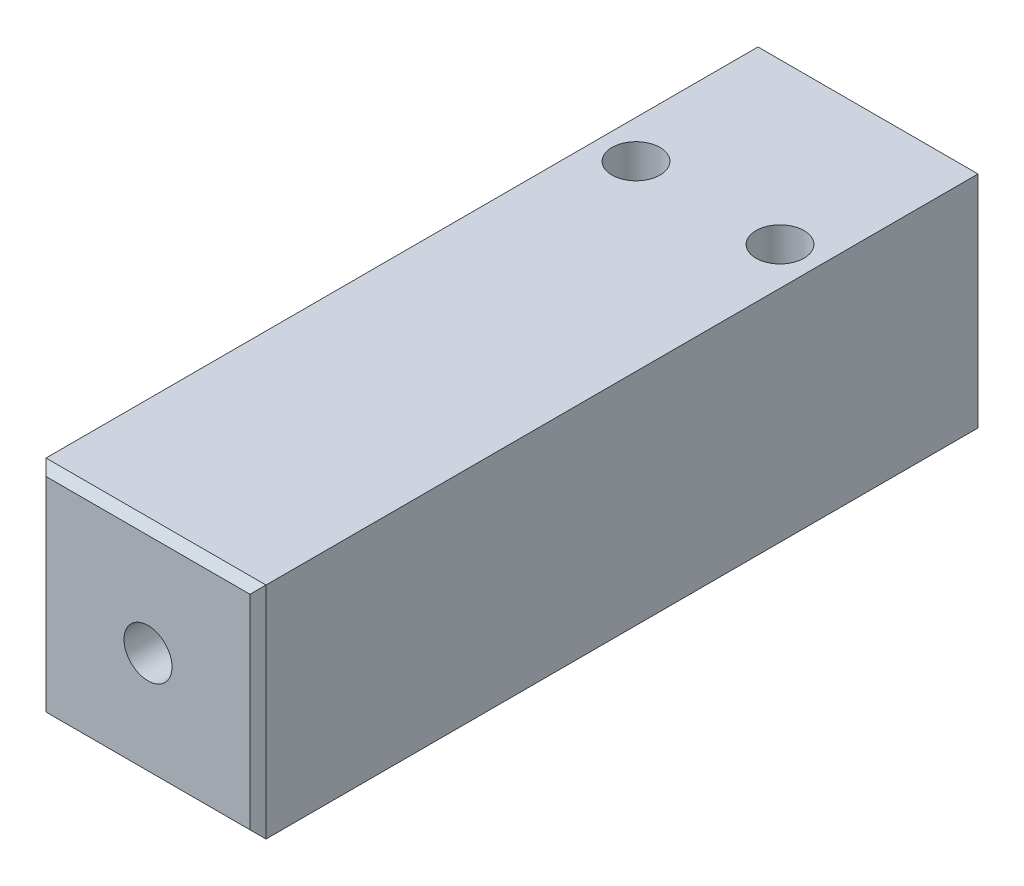
ISO-10303-21;
HEADER;
FILE_DESCRIPTION(('STEP AP214'),'2;1');
FILE_NAME('part.step','',(''),(''),'','','');
FILE_SCHEMA(('AUTOMOTIVE_DESIGN { 1 0 10303 214 1 1 1 1 }'));
ENDSEC;
DATA;
#1=APPLICATION_CONTEXT('core data for automotive mechanical design processes');
#2=APPLICATION_PROTOCOL_DEFINITION('international standard','automotive_design',2000,#1);
#3=PRODUCT_CONTEXT('',#1,'mechanical');
#4=PRODUCT('Part','Part','',(#3));
#5=PRODUCT_RELATED_PRODUCT_CATEGORY('part','',(#4));
#6=PRODUCT_DEFINITION_FORMATION('','',#4);
#7=PRODUCT_DEFINITION_CONTEXT('part definition',#1,'design');
#8=PRODUCT_DEFINITION('design','',#6,#7);
#9=PRODUCT_DEFINITION_SHAPE('','',#8);
#10=(LENGTH_UNIT() NAMED_UNIT(*) SI_UNIT(.MILLI.,.METRE.));
#11=(NAMED_UNIT(*) PLANE_ANGLE_UNIT() SI_UNIT($,.RADIAN.));
#12=(NAMED_UNIT(*) SI_UNIT($,.STERADIAN.) SOLID_ANGLE_UNIT());
#13=UNCERTAINTY_MEASURE_WITH_UNIT(LENGTH_MEASURE(1.E-05),#10,'distance_accuracy_value','');
#14=(GEOMETRIC_REPRESENTATION_CONTEXT(3) GLOBAL_UNCERTAINTY_ASSIGNED_CONTEXT((#13)) GLOBAL_UNIT_ASSIGNED_CONTEXT((#10,
#11,#12)) REPRESENTATION_CONTEXT('',''));
#15=CARTESIAN_POINT('',(0.,0.,0.));
#16=DIRECTION('',(0.,0.,1.));
#17=DIRECTION('',(1.,0.,0.));
#18=AXIS2_PLACEMENT_3D('',#15,#16,#17);
#19=CARTESIAN_POINT('',(27.5,27.5,-180.));
#20=DIRECTION('',(1.,0.,0.));
#21=DIRECTION('',(0.,1.,0.));
#22=AXIS2_PLACEMENT_3D('',#19,#20,#21);
#23=PLANE('',#22);
#24=DIRECTION('',(0.,0.,1.));
#25=VECTOR('',#24,1.);
#26=CARTESIAN_POINT('',(27.5,27.5,-180.));
#27=LINE('',#26,#25);
#28=CARTESIAN_POINT('',(27.5,27.5,-180.));
#29=VERTEX_POINT('',#28);
#30=CARTESIAN_POINT('',(27.5,27.5,-2.00000000000006));
#31=VERTEX_POINT('',#30);
#32=EDGE_CURVE('E84',#29,#31,#27,.T.);
#33=ORIENTED_EDGE('',*,*,#32,.T.);
#34=DIRECTION('',(0.,-1.,0.));
#35=VECTOR('',#34,1.);
#36=CARTESIAN_POINT('',(27.5,27.5,-2.));
#37=LINE('',#36,#35);
#38=CARTESIAN_POINT('',(27.5,-27.5,-2.00000000000006));
#39=VERTEX_POINT('',#38);
#40=EDGE_CURVE('E41',#31,#39,#37,.T.);
#41=ORIENTED_EDGE('',*,*,#40,.T.);
#42=DIRECTION('',(0.,0.,1.));
#43=VECTOR('',#42,1.);
#44=CARTESIAN_POINT('',(27.5,-27.5,-180.));
#45=LINE('',#44,#43);
#46=CARTESIAN_POINT('',(27.5,-27.5,-180.));
#47=VERTEX_POINT('',#46);
#48=EDGE_CURVE('E105',#47,#39,#45,.T.);
#49=ORIENTED_EDGE('',*,*,#48,.F.);
#50=DIRECTION('',(0.,1.,0.));
#51=VECTOR('',#50,1.);
#52=CARTESIAN_POINT('',(27.5,27.5,-180.));
#53=LINE('',#52,#51);
#54=EDGE_CURVE('E99',#47,#29,#53,.T.);
#55=ORIENTED_EDGE('',*,*,#54,.T.);
#56=EDGE_LOOP('',(#33,#41,#49,#55));
#57=FACE_BOUND('',#56,.T.);
#58=ADVANCED_FACE('F32',(#57),#23,.T.);
#59=CARTESIAN_POINT('',(-27.5,-27.5,-180.));
#60=DIRECTION('',(0.,-1.,0.));
#61=DIRECTION('',(0.,0.,-1.));
#62=AXIS2_PLACEMENT_3D('',#59,#60,#61);
#63=PLANE('',#62);
#64=ORIENTED_EDGE('',*,*,#48,.T.);
#65=DIRECTION('',(-1.,0.,0.));
#66=VECTOR('',#65,1.);
#67=CARTESIAN_POINT('',(-27.5,-27.5,-2.));
#68=LINE('',#67,#66);
#69=CARTESIAN_POINT('',(-27.5,-27.5,-2.00000000000006));
#70=VERTEX_POINT('',#69);
#71=EDGE_CURVE('E128',#39,#70,#68,.T.);
#72=ORIENTED_EDGE('',*,*,#71,.T.);
#73=DIRECTION('',(0.,0.,1.));
#74=VECTOR('',#73,1.);
#75=CARTESIAN_POINT('',(-27.5,-27.5,-180.));
#76=LINE('',#75,#74);
#77=CARTESIAN_POINT('',(-27.5,-27.5,-180.));
#78=VERTEX_POINT('',#77);
#79=EDGE_CURVE('E117',#78,#70,#76,.T.);
#80=ORIENTED_EDGE('',*,*,#79,.F.);
#81=DIRECTION('',(1.,0.,0.));
#82=VECTOR('',#81,1.);
#83=CARTESIAN_POINT('',(-27.5,-27.5,-180.));
#84=LINE('',#83,#82);
#85=EDGE_CURVE('E92',#78,#47,#84,.T.);
#86=ORIENTED_EDGE('',*,*,#85,.T.);
#87=EDGE_LOOP('',(#64,#72,#80,#86));
#88=FACE_BOUND('',#87,.T.);
#89=ADVANCED_FACE('F205',(#88),#63,.T.);
#90=CARTESIAN_POINT('',(-27.5,27.5,-180.));
#91=DIRECTION('',(-1.,0.,0.));
#92=DIRECTION('',(0.,-1.,0.));
#93=AXIS2_PLACEMENT_3D('',#90,#91,#92);
#94=PLANE('',#93);
#95=ORIENTED_EDGE('',*,*,#79,.T.);
#96=DIRECTION('',(0.,1.,0.));
#97=VECTOR('',#96,1.);
#98=CARTESIAN_POINT('',(-27.5,27.5,-2.));
#99=LINE('',#98,#97);
#100=CARTESIAN_POINT('',(-27.5,27.5,-2.00000000000006));
#101=VERTEX_POINT('',#100);
#102=EDGE_CURVE('E55',#70,#101,#99,.T.);
#103=ORIENTED_EDGE('',*,*,#102,.T.);
#104=DIRECTION('',(0.,0.,1.));
#105=VECTOR('',#104,1.);
#106=CARTESIAN_POINT('',(-27.5,27.5,-180.));
#107=LINE('',#106,#105);
#108=CARTESIAN_POINT('',(-27.5,27.5,-180.));
#109=VERTEX_POINT('',#108);
#110=EDGE_CURVE('E91',#109,#101,#107,.T.);
#111=ORIENTED_EDGE('',*,*,#110,.F.);
#112=DIRECTION('',(0.,-1.,0.));
#113=VECTOR('',#112,1.);
#114=CARTESIAN_POINT('',(-27.5,27.5,-180.));
#115=LINE('',#114,#113);
#116=EDGE_CURVE('E102',#109,#78,#115,.T.);
#117=ORIENTED_EDGE('',*,*,#116,.T.);
#118=EDGE_LOOP('',(#95,#103,#111,#117));
#119=FACE_BOUND('',#118,.T.);
#120=ADVANCED_FACE('F198',(#119),#94,.T.);
#121=CARTESIAN_POINT('',(-27.5,27.5,-180.));
#122=DIRECTION('',(0.,1.,0.));
#123=DIRECTION('',(0.,0.,1.));
#124=AXIS2_PLACEMENT_3D('',#121,#122,#123);
#125=PLANE('',#124);
#126=CARTESIAN_POINT('',(18.,27.5,-140.));
#127=DIRECTION('',(0.,1.,0.));
#128=DIRECTION('',(0.,0.,1.));
#129=AXIS2_PLACEMENT_3D('',#126,#127,#128);
#130=CIRCLE('',#129,6.);
#131=CARTESIAN_POINT('',(18.,27.5,-134.));
#132=VERTEX_POINT('',#131);
#133=EDGE_CURVE('E142',#132,#132,#130,.T.);
#134=ORIENTED_EDGE('',*,*,#133,.F.);
#135=EDGE_LOOP('',(#134));
#136=FACE_BOUND('',#135,.T.);
#137=CARTESIAN_POINT('',(-18.,27.5,-140.));
#138=DIRECTION('',(0.,1.,0.));
#139=DIRECTION('',(0.,0.,1.));
#140=AXIS2_PLACEMENT_3D('',#137,#138,#139);
#141=CIRCLE('',#140,6.);
#142=CARTESIAN_POINT('',(-18.,27.5,-134.));
#143=VERTEX_POINT('',#142);
#144=EDGE_CURVE('E152',#143,#143,#141,.T.);
#145=ORIENTED_EDGE('',*,*,#144,.F.);
#146=EDGE_LOOP('',(#145));
#147=FACE_BOUND('',#146,.T.);
#148=ORIENTED_EDGE('',*,*,#110,.T.);
#149=DIRECTION('',(1.,0.,0.));
#150=VECTOR('',#149,1.);
#151=CARTESIAN_POINT('',(-27.5,27.5,-2.));
#152=LINE('',#151,#150);
#153=EDGE_CURVE('E11',#101,#31,#152,.T.);
#154=ORIENTED_EDGE('',*,*,#153,.T.);
#155=ORIENTED_EDGE('',*,*,#32,.F.);
#156=DIRECTION('',(-1.,0.,0.));
#157=VECTOR('',#156,1.);
#158=CARTESIAN_POINT('',(-27.5,27.5,-180.));
#159=LINE('',#158,#157);
#160=EDGE_CURVE('E87',#29,#109,#159,.T.);
#161=ORIENTED_EDGE('',*,*,#160,.T.);
#162=EDGE_LOOP('',(#148,#154,#155,#161));
#163=FACE_BOUND('',#162,.T.);
#164=ADVANCED_FACE('F86',(#136,#147,#163),#125,.T.);
#165=CARTESIAN_POINT('',(0.,0.,-180.));
#166=DIRECTION('',(0.,0.,1.));
#167=DIRECTION('',(1.,0.,0.));
#168=AXIS2_PLACEMENT_3D('',#165,#166,#167);
#169=PLANE('',#168);
#170=CARTESIAN_POINT('',(-18.,-18.,-180.));
#171=DIRECTION('',(0.,0.,-1.));
#172=DIRECTION('',(-1.,0.,0.));
#173=AXIS2_PLACEMENT_3D('',#170,#171,#172);
#174=CIRCLE('',#173,4.);
#175=CARTESIAN_POINT('',(-22.,-18.,-180.));
#176=VERTEX_POINT('',#175);
#177=EDGE_CURVE('E158',#176,#176,#174,.T.);
#178=ORIENTED_EDGE('',*,*,#177,.F.);
#179=EDGE_LOOP('',(#178));
#180=FACE_BOUND('',#179,.T.);
#181=CARTESIAN_POINT('',(18.,-18.,-180.));
#182=DIRECTION('',(0.,0.,-1.));
#183=DIRECTION('',(-1.,0.,0.));
#184=AXIS2_PLACEMENT_3D('',#181,#182,#183);
#185=CIRCLE('',#184,4.);
#186=CARTESIAN_POINT('',(14.,-18.,-180.));
#187=VERTEX_POINT('',#186);
#188=EDGE_CURVE('E164',#187,#187,#185,.T.);
#189=ORIENTED_EDGE('',*,*,#188,.F.);
#190=EDGE_LOOP('',(#189));
#191=FACE_BOUND('',#190,.T.);
#192=CARTESIAN_POINT('',(18.,18.,-180.));
#193=DIRECTION('',(0.,0.,-1.));
#194=DIRECTION('',(-1.,0.,0.));
#195=AXIS2_PLACEMENT_3D('',#192,#193,#194);
#196=CIRCLE('',#195,4.);
#197=CARTESIAN_POINT('',(14.,18.,-180.));
#198=VERTEX_POINT('',#197);
#199=EDGE_CURVE('E170',#198,#198,#196,.T.);
#200=ORIENTED_EDGE('',*,*,#199,.F.);
#201=EDGE_LOOP('',(#200));
#202=FACE_BOUND('',#201,.T.);
#203=CARTESIAN_POINT('',(-18.,18.,-180.));
#204=DIRECTION('',(0.,0.,-1.));
#205=DIRECTION('',(-1.,0.,0.));
#206=AXIS2_PLACEMENT_3D('',#203,#204,#205);
#207=CIRCLE('',#206,4.);
#208=CARTESIAN_POINT('',(-22.,18.,-180.));
#209=VERTEX_POINT('',#208);
#210=EDGE_CURVE('E176',#209,#209,#207,.T.);
#211=ORIENTED_EDGE('',*,*,#210,.F.);
#212=EDGE_LOOP('',(#211));
#213=FACE_BOUND('',#212,.T.);
#214=ORIENTED_EDGE('',*,*,#54,.F.);
#215=ORIENTED_EDGE('',*,*,#85,.F.);
#216=ORIENTED_EDGE('',*,*,#116,.F.);
#217=ORIENTED_EDGE('',*,*,#160,.F.);
#218=EDGE_LOOP('',(#214,#215,#216,#217));
#219=FACE_BOUND('',#218,.T.);
#220=ADVANCED_FACE('F97',(#180,#191,#202,#213,#219),#169,.F.);
#221=CARTESIAN_POINT('',(0.,0.,0.));
#222=DIRECTION('',(0.,0.,1.));
#223=DIRECTION('',(1.,0.,0.));
#224=AXIS2_PLACEMENT_3D('',#221,#222,#223);
#225=PLANE('',#224);
#226=DIRECTION('',(0.,-1.,0.));
#227=VECTOR('',#226,1.);
#228=CARTESIAN_POINT('',(-25.5,0.,0.));
#229=LINE('',#228,#227);
#230=CARTESIAN_POINT('',(-25.5,25.5,0.));
#231=VERTEX_POINT('',#230);
#232=CARTESIAN_POINT('',(-25.5,-25.5,0.));
#233=VERTEX_POINT('',#232);
#234=EDGE_CURVE('E123',#231,#233,#229,.T.);
#235=ORIENTED_EDGE('',*,*,#234,.T.);
#236=DIRECTION('',(1.,0.,0.));
#237=VECTOR('',#236,1.);
#238=CARTESIAN_POINT('',(0.,-25.5,0.));
#239=LINE('',#238,#237);
#240=CARTESIAN_POINT('',(25.5,-25.5,0.));
#241=VERTEX_POINT('',#240);
#242=EDGE_CURVE('E125',#233,#241,#239,.T.);
#243=ORIENTED_EDGE('',*,*,#242,.T.);
#244=DIRECTION('',(0.,1.,0.));
#245=VECTOR('',#244,1.);
#246=CARTESIAN_POINT('',(25.5,0.,0.));
#247=LINE('',#246,#245);
#248=CARTESIAN_POINT('',(25.5,25.5,0.));
#249=VERTEX_POINT('',#248);
#250=EDGE_CURVE('E121',#241,#249,#247,.T.);
#251=ORIENTED_EDGE('',*,*,#250,.T.);
#252=DIRECTION('',(-1.,0.,0.));
#253=VECTOR('',#252,1.);
#254=CARTESIAN_POINT('',(0.,25.5,0.));
#255=LINE('',#254,#253);
#256=EDGE_CURVE('E116',#249,#231,#255,.T.);
#257=ORIENTED_EDGE('',*,*,#256,.T.);
#258=EDGE_LOOP('',(#235,#243,#251,#257));
#259=FACE_BOUND('',#258,.T.);
#260=CARTESIAN_POINT('',(0.,0.,0.));
#261=DIRECTION('',(0.,0.,1.));
#262=DIRECTION('',(1.,0.,0.));
#263=AXIS2_PLACEMENT_3D('',#260,#261,#262);
#264=CIRCLE('',#263,6.);
#265=CARTESIAN_POINT('',(6.,0.,0.));
#266=VERTEX_POINT('',#265);
#267=EDGE_CURVE('E109',#266,#266,#264,.T.);
#268=ORIENTED_EDGE('',*,*,#267,.F.);
#269=EDGE_LOOP('',(#268));
#270=FACE_BOUND('',#269,.T.);
#271=ADVANCED_FACE('F188',(#259,#270),#225,.T.);
#272=CARTESIAN_POINT('',(0.,0.,-30.));
#273=DIRECTION('',(0.,0.,1.));
#274=DIRECTION('',(1.,0.,0.));
#275=AXIS2_PLACEMENT_3D('',#272,#273,#274);
#276=CYLINDRICAL_SURFACE('',#275,6.);
#277=CARTESIAN_POINT('',(0.,0.,-30.));
#278=DIRECTION('',(0.,0.,1.));
#279=DIRECTION('',(1.,0.,0.));
#280=AXIS2_PLACEMENT_3D('',#277,#278,#279);
#281=CIRCLE('',#280,6.);
#282=CARTESIAN_POINT('',(6.,0.,-30.));
#283=VERTEX_POINT('',#282);
#284=EDGE_CURVE('E106',#283,#283,#281,.T.);
#285=ORIENTED_EDGE('',*,*,#284,.F.);
#286=EDGE_LOOP('',(#285));
#287=FACE_BOUND('',#286,.T.);
#288=ORIENTED_EDGE('',*,*,#267,.T.);
#289=EDGE_LOOP('',(#288));
#290=FACE_BOUND('',#289,.T.);
#291=ADVANCED_FACE('F195',(#287,#290),#276,.F.);
#292=CARTESIAN_POINT('',(0.,0.,-30.));
#293=DIRECTION('',(0.,0.,1.));
#294=DIRECTION('',(1.,0.,0.));
#295=AXIS2_PLACEMENT_3D('',#292,#293,#294);
#296=PLANE('',#295);
#297=ORIENTED_EDGE('',*,*,#284,.T.);
#298=EDGE_LOOP('',(#297));
#299=FACE_BOUND('',#298,.T.);
#300=ADVANCED_FACE('F243',(#299),#296,.T.);
#301=CARTESIAN_POINT('',(-18.,18.,-155.));
#302=DIRECTION('',(0.,0.,-1.));
#303=DIRECTION('',(-1.,0.,0.));
#304=AXIS2_PLACEMENT_3D('',#301,#302,#303);
#305=CYLINDRICAL_SURFACE('',#304,4.);
#306=CARTESIAN_POINT('',(-18.,18.,-155.));
#307=DIRECTION('',(0.,0.,-1.));
#308=DIRECTION('',(-1.,0.,0.));
#309=AXIS2_PLACEMENT_3D('',#306,#307,#308);
#310=CIRCLE('',#309,4.);
#311=CARTESIAN_POINT('',(-22.,18.,-155.));
#312=VERTEX_POINT('',#311);
#313=EDGE_CURVE('E179',#312,#312,#310,.T.);
#314=ORIENTED_EDGE('',*,*,#313,.F.);
#315=EDGE_LOOP('',(#314));
#316=FACE_BOUND('',#315,.T.);
#317=ORIENTED_EDGE('',*,*,#210,.T.);
#318=EDGE_LOOP('',(#317));
#319=FACE_BOUND('',#318,.T.);
#320=ADVANCED_FACE('F185',(#316,#319),#305,.F.);
#321=CARTESIAN_POINT('',(-18.,18.,-155.));
#322=DIRECTION('',(0.,0.,-1.));
#323=DIRECTION('',(-1.,0.,0.));
#324=AXIS2_PLACEMENT_3D('',#321,#322,#323);
#325=PLANE('',#324);
#326=ORIENTED_EDGE('',*,*,#313,.T.);
#327=EDGE_LOOP('',(#326));
#328=FACE_BOUND('',#327,.T.);
#329=ADVANCED_FACE('F254',(#328),#325,.T.);
#330=CARTESIAN_POINT('',(18.,18.,-155.));
#331=DIRECTION('',(0.,0.,-1.));
#332=DIRECTION('',(-1.,0.,0.));
#333=AXIS2_PLACEMENT_3D('',#330,#331,#332);
#334=CYLINDRICAL_SURFACE('',#333,4.);
#335=CARTESIAN_POINT('',(18.,18.,-155.));
#336=DIRECTION('',(0.,0.,-1.));
#337=DIRECTION('',(-1.,0.,0.));
#338=AXIS2_PLACEMENT_3D('',#335,#336,#337);
#339=CIRCLE('',#338,4.);
#340=CARTESIAN_POINT('',(14.,18.,-155.));
#341=VERTEX_POINT('',#340);
#342=EDGE_CURVE('E173',#341,#341,#339,.T.);
#343=ORIENTED_EDGE('',*,*,#342,.F.);
#344=EDGE_LOOP('',(#343));
#345=FACE_BOUND('',#344,.T.);
#346=ORIENTED_EDGE('',*,*,#199,.T.);
#347=EDGE_LOOP('',(#346));
#348=FACE_BOUND('',#347,.T.);
#349=ADVANCED_FACE('F258',(#345,#348),#334,.F.);
#350=CARTESIAN_POINT('',(18.,18.,-155.));
#351=DIRECTION('',(0.,0.,-1.));
#352=DIRECTION('',(-1.,0.,0.));
#353=AXIS2_PLACEMENT_3D('',#350,#351,#352);
#354=PLANE('',#353);
#355=ORIENTED_EDGE('',*,*,#342,.T.);
#356=EDGE_LOOP('',(#355));
#357=FACE_BOUND('',#356,.T.);
#358=ADVANCED_FACE('F262',(#357),#354,.T.);
#359=CARTESIAN_POINT('',(18.,-18.,-155.));
#360=DIRECTION('',(0.,0.,-1.));
#361=DIRECTION('',(-1.,0.,0.));
#362=AXIS2_PLACEMENT_3D('',#359,#360,#361);
#363=CYLINDRICAL_SURFACE('',#362,4.);
#364=CARTESIAN_POINT('',(18.,-18.,-155.));
#365=DIRECTION('',(0.,0.,-1.));
#366=DIRECTION('',(-1.,0.,0.));
#367=AXIS2_PLACEMENT_3D('',#364,#365,#366);
#368=CIRCLE('',#367,4.);
#369=CARTESIAN_POINT('',(14.,-18.,-155.));
#370=VERTEX_POINT('',#369);
#371=EDGE_CURVE('E167',#370,#370,#368,.T.);
#372=ORIENTED_EDGE('',*,*,#371,.F.);
#373=EDGE_LOOP('',(#372));
#374=FACE_BOUND('',#373,.T.);
#375=ORIENTED_EDGE('',*,*,#188,.T.);
#376=EDGE_LOOP('',(#375));
#377=FACE_BOUND('',#376,.T.);
#378=ADVANCED_FACE('F266',(#374,#377),#363,.F.);
#379=CARTESIAN_POINT('',(18.,-18.,-155.));
#380=DIRECTION('',(0.,0.,-1.));
#381=DIRECTION('',(-1.,0.,0.));
#382=AXIS2_PLACEMENT_3D('',#379,#380,#381);
#383=PLANE('',#382);
#384=ORIENTED_EDGE('',*,*,#371,.T.);
#385=EDGE_LOOP('',(#384));
#386=FACE_BOUND('',#385,.T.);
#387=ADVANCED_FACE('F270',(#386),#383,.T.);
#388=CARTESIAN_POINT('',(-18.,-18.,-155.));
#389=DIRECTION('',(0.,0.,-1.));
#390=DIRECTION('',(-1.,0.,0.));
#391=AXIS2_PLACEMENT_3D('',#388,#389,#390);
#392=CYLINDRICAL_SURFACE('',#391,4.);
#393=CARTESIAN_POINT('',(-18.,-18.,-155.));
#394=DIRECTION('',(0.,0.,-1.));
#395=DIRECTION('',(-1.,0.,0.));
#396=AXIS2_PLACEMENT_3D('',#393,#394,#395);
#397=CIRCLE('',#396,4.);
#398=CARTESIAN_POINT('',(-22.,-18.,-155.));
#399=VERTEX_POINT('',#398);
#400=EDGE_CURVE('E161',#399,#399,#397,.T.);
#401=ORIENTED_EDGE('',*,*,#400,.F.);
#402=EDGE_LOOP('',(#401));
#403=FACE_BOUND('',#402,.T.);
#404=ORIENTED_EDGE('',*,*,#177,.T.);
#405=EDGE_LOOP('',(#404));
#406=FACE_BOUND('',#405,.T.);
#407=ADVANCED_FACE('F274',(#403,#406),#392,.F.);
#408=CARTESIAN_POINT('',(-18.,-18.,-155.));
#409=DIRECTION('',(0.,0.,-1.));
#410=DIRECTION('',(-1.,0.,0.));
#411=AXIS2_PLACEMENT_3D('',#408,#409,#410);
#412=PLANE('',#411);
#413=ORIENTED_EDGE('',*,*,#400,.T.);
#414=EDGE_LOOP('',(#413));
#415=FACE_BOUND('',#414,.T.);
#416=ADVANCED_FACE('F278',(#415),#412,.T.);
#417=CARTESIAN_POINT('',(-18.,15.5,-140.));
#418=DIRECTION('',(0.,1.,0.));
#419=DIRECTION('',(0.,0.,1.));
#420=AXIS2_PLACEMENT_3D('',#417,#418,#419);
#421=CYLINDRICAL_SURFACE('',#420,6.);
#422=CARTESIAN_POINT('',(-18.,15.5,-140.));
#423=DIRECTION('',(0.,1.,0.));
#424=DIRECTION('',(0.,0.,1.));
#425=AXIS2_PLACEMENT_3D('',#422,#423,#424);
#426=CIRCLE('',#425,6.);
#427=CARTESIAN_POINT('',(-18.,15.5,-134.));
#428=VERTEX_POINT('',#427);
#429=EDGE_CURVE('E155',#428,#428,#426,.T.);
#430=ORIENTED_EDGE('',*,*,#429,.F.);
#431=EDGE_LOOP('',(#430));
#432=FACE_BOUND('',#431,.T.);
#433=ORIENTED_EDGE('',*,*,#144,.T.);
#434=EDGE_LOOP('',(#433));
#435=FACE_BOUND('',#434,.T.);
#436=ADVANCED_FACE('F282',(#432,#435),#421,.F.);
#437=CARTESIAN_POINT('',(-18.,15.5,-140.));
#438=DIRECTION('',(0.,1.,0.));
#439=DIRECTION('',(0.,0.,1.));
#440=AXIS2_PLACEMENT_3D('',#437,#438,#439);
#441=PLANE('',#440);
#442=ORIENTED_EDGE('',*,*,#429,.T.);
#443=EDGE_LOOP('',(#442));
#444=FACE_BOUND('',#443,.T.);
#445=ADVANCED_FACE('F286',(#444),#441,.T.);
#446=CARTESIAN_POINT('',(18.,15.5,-140.));
#447=DIRECTION('',(0.,1.,0.));
#448=DIRECTION('',(0.,0.,1.));
#449=AXIS2_PLACEMENT_3D('',#446,#447,#448);
#450=CYLINDRICAL_SURFACE('',#449,6.);
#451=CARTESIAN_POINT('',(18.,15.5,-140.));
#452=DIRECTION('',(0.,1.,0.));
#453=DIRECTION('',(0.,0.,1.));
#454=AXIS2_PLACEMENT_3D('',#451,#452,#453);
#455=CIRCLE('',#454,6.);
#456=CARTESIAN_POINT('',(18.,15.5,-134.));
#457=VERTEX_POINT('',#456);
#458=EDGE_CURVE('E147',#457,#457,#455,.T.);
#459=ORIENTED_EDGE('',*,*,#458,.F.);
#460=EDGE_LOOP('',(#459));
#461=FACE_BOUND('',#460,.T.);
#462=ORIENTED_EDGE('',*,*,#133,.T.);
#463=EDGE_LOOP('',(#462));
#464=FACE_BOUND('',#463,.T.);
#465=ADVANCED_FACE('F230',(#461,#464),#450,.F.);
#466=CARTESIAN_POINT('',(18.,15.5,-140.));
#467=DIRECTION('',(0.,1.,0.));
#468=DIRECTION('',(0.,0.,1.));
#469=AXIS2_PLACEMENT_3D('',#466,#467,#468);
#470=PLANE('',#469);
#471=ORIENTED_EDGE('',*,*,#458,.T.);
#472=EDGE_LOOP('',(#471));
#473=FACE_BOUND('',#472,.T.);
#474=ADVANCED_FACE('F225',(#473),#470,.T.);
#475=CARTESIAN_POINT('',(0.,25.5,0.));
#476=DIRECTION('',(0.,-0.707106781186552,-0.707106781186543));
#477=DIRECTION('',(-1.,0.,0.));
#478=AXIS2_PLACEMENT_3D('',#475,#476,#477);
#479=PLANE('',#478);
#480=DIRECTION('',(0.577350269189623,0.577350269189623,-0.577350269189631));
#481=VECTOR('',#480,1.);
#482=CARTESIAN_POINT('',(17.0000000000001,17.0000000000001,8.50000000000005));
#483=LINE('',#482,#481);
#484=EDGE_CURVE('E136',#31,#249,#483,.F.);
#485=ORIENTED_EDGE('',*,*,#484,.F.);
#486=ORIENTED_EDGE('',*,*,#153,.F.);
#487=DIRECTION('',(0.577350269189623,-0.577350269189623,0.577350269189631));
#488=VECTOR('',#487,1.);
#489=CARTESIAN_POINT('',(-17.0000000000001,17.0000000000001,8.50000000000005));
#490=LINE('',#489,#488);
#491=EDGE_CURVE('E36',#231,#101,#490,.F.);
#492=ORIENTED_EDGE('',*,*,#491,.F.);
#493=ORIENTED_EDGE('',*,*,#256,.F.);
#494=EDGE_LOOP('',(#485,#486,#492,#493));
#495=FACE_BOUND('',#494,.T.);
#496=ADVANCED_FACE('F34',(#495),#479,.F.);
#497=CARTESIAN_POINT('',(-25.5,0.,0.));
#498=DIRECTION('',(0.707106781186552,0.,-0.707106781186543));
#499=DIRECTION('',(0.,-1.,0.));
#500=AXIS2_PLACEMENT_3D('',#497,#498,#499);
#501=PLANE('',#500);
#502=ORIENTED_EDGE('',*,*,#491,.T.);
#503=ORIENTED_EDGE('',*,*,#102,.F.);
#504=DIRECTION('',(0.577350269189623,0.577350269189623,0.577350269189631));
#505=VECTOR('',#504,1.);
#506=CARTESIAN_POINT('',(-17.0000000000001,-17.0000000000001,8.50000000000005));
#507=LINE('',#506,#505);
#508=EDGE_CURVE('E135',#233,#70,#507,.F.);
#509=ORIENTED_EDGE('',*,*,#508,.F.);
#510=ORIENTED_EDGE('',*,*,#234,.F.);
#511=EDGE_LOOP('',(#502,#503,#509,#510));
#512=FACE_BOUND('',#511,.T.);
#513=ADVANCED_FACE('F220',(#512),#501,.F.);
#514=CARTESIAN_POINT('',(25.5,0.,0.));
#515=DIRECTION('',(-0.707106781186552,0.,-0.707106781186543));
#516=DIRECTION('',(0.,1.,0.));
#517=AXIS2_PLACEMENT_3D('',#514,#515,#516);
#518=PLANE('',#517);
#519=ORIENTED_EDGE('',*,*,#484,.T.);
#520=ORIENTED_EDGE('',*,*,#250,.F.);
#521=DIRECTION('',(0.577350269189623,-0.577350269189623,-0.577350269189631));
#522=VECTOR('',#521,1.);
#523=CARTESIAN_POINT('',(17.0000000000001,-17.0000000000001,8.50000000000005));
#524=LINE('',#523,#522);
#525=EDGE_CURVE('E133',#39,#241,#524,.F.);
#526=ORIENTED_EDGE('',*,*,#525,.F.);
#527=ORIENTED_EDGE('',*,*,#40,.F.);
#528=EDGE_LOOP('',(#519,#520,#526,#527));
#529=FACE_BOUND('',#528,.T.);
#530=ADVANCED_FACE('F217',(#529),#518,.F.);
#531=CARTESIAN_POINT('',(0.,-25.5,0.));
#532=DIRECTION('',(0.,0.707106781186552,-0.707106781186543));
#533=DIRECTION('',(1.,0.,0.));
#534=AXIS2_PLACEMENT_3D('',#531,#532,#533);
#535=PLANE('',#534);
#536=ORIENTED_EDGE('',*,*,#508,.T.);
#537=ORIENTED_EDGE('',*,*,#71,.F.);
#538=ORIENTED_EDGE('',*,*,#525,.T.);
#539=ORIENTED_EDGE('',*,*,#242,.F.);
#540=EDGE_LOOP('',(#536,#537,#538,#539));
#541=FACE_BOUND('',#540,.T.);
#542=ADVANCED_FACE('F214',(#541),#535,.F.);
#543=CLOSED_SHELL('',(#58,#89,#120,#164,#220,#271,#291,#300,#320,#329,#349,#358,#378,#387,#407,
#416,#436,#445,#465,#474,#496,#513,#530,#542));
#544=MANIFOLD_SOLID_BREP('B2',#543);
#545=ADVANCED_BREP_SHAPE_REPRESENTATION('',(#18,#544),#14);
#546=SHAPE_DEFINITION_REPRESENTATION(#9,#545);
ENDSEC;
END-ISO-10303-21;
